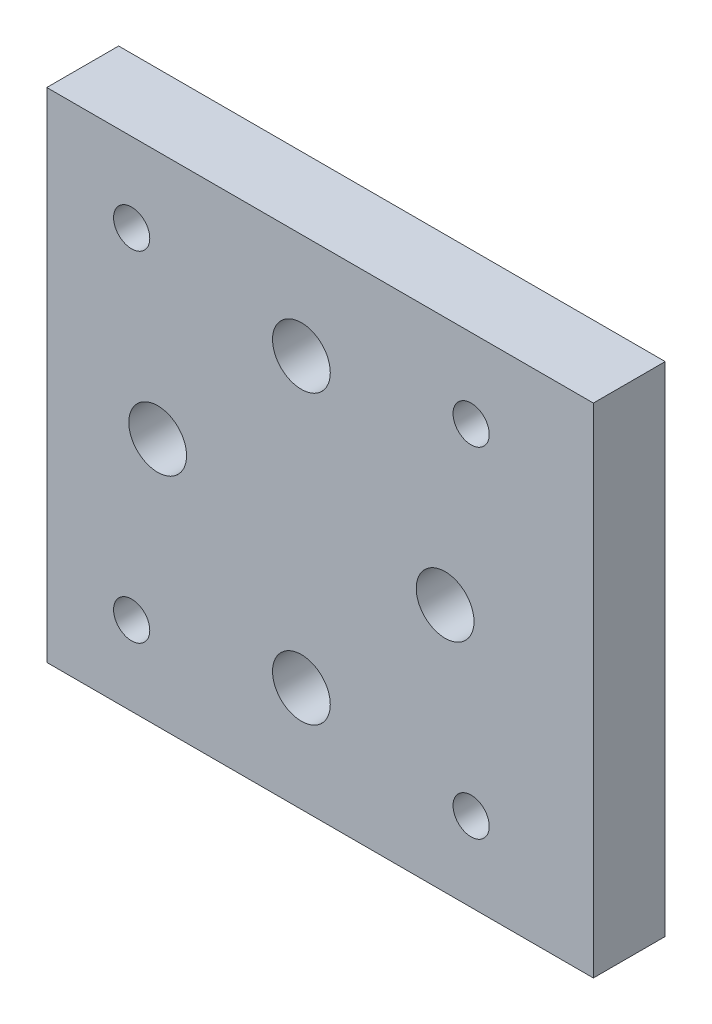
ISO-10303-21;
HEADER;
FILE_DESCRIPTION(('STEP AP214'),'2;1');
FILE_NAME('part.step','',(''),(''),'','','');
FILE_SCHEMA(('AUTOMOTIVE_DESIGN { 1 0 10303 214 1 1 1 1 }'));
ENDSEC;
DATA;
#1=APPLICATION_CONTEXT('core data for automotive mechanical design processes');
#2=APPLICATION_PROTOCOL_DEFINITION('international standard','automotive_design',2000,#1);
#3=PRODUCT_CONTEXT('',#1,'mechanical');
#4=PRODUCT('Part','Part','',(#3));
#5=PRODUCT_RELATED_PRODUCT_CATEGORY('part','',(#4));
#6=PRODUCT_DEFINITION_FORMATION('','',#4);
#7=PRODUCT_DEFINITION_CONTEXT('part definition',#1,'design');
#8=PRODUCT_DEFINITION('design','',#6,#7);
#9=PRODUCT_DEFINITION_SHAPE('','',#8);
#10=(LENGTH_UNIT() NAMED_UNIT(*) SI_UNIT(.MILLI.,.METRE.));
#11=(NAMED_UNIT(*) PLANE_ANGLE_UNIT() SI_UNIT($,.RADIAN.));
#12=(NAMED_UNIT(*) SI_UNIT($,.STERADIAN.) SOLID_ANGLE_UNIT());
#13=UNCERTAINTY_MEASURE_WITH_UNIT(LENGTH_MEASURE(1.E-05),#10,'distance_accuracy_value','');
#14=(GEOMETRIC_REPRESENTATION_CONTEXT(3) GLOBAL_UNCERTAINTY_ASSIGNED_CONTEXT((#13)) GLOBAL_UNIT_ASSIGNED_CONTEXT((#10,
#11,#12)) REPRESENTATION_CONTEXT('',''));
#15=CARTESIAN_POINT('',(0.,0.,0.));
#16=DIRECTION('',(0.,0.,1.));
#17=DIRECTION('',(1.,0.,0.));
#18=AXIS2_PLACEMENT_3D('',#15,#16,#17);
#19=CARTESIAN_POINT('',(48.3,0.,6.35));
#20=DIRECTION('',(1.,0.,0.));
#21=DIRECTION('',(0.,1.,0.));
#22=AXIS2_PLACEMENT_3D('',#19,#20,#21);
#23=PLANE('',#22);
#24=DIRECTION('',(0.,-1.,0.));
#25=VECTOR('',#24,1.);
#26=CARTESIAN_POINT('',(48.3,0.,0.));
#27=LINE('',#26,#25);
#28=CARTESIAN_POINT('',(48.3,0.,0.));
#29=VERTEX_POINT('',#28);
#30=CARTESIAN_POINT('',(48.3,-44.,0.));
#31=VERTEX_POINT('',#30);
#32=EDGE_CURVE('E140',#29,#31,#27,.T.);
#33=ORIENTED_EDGE('',*,*,#32,.F.);
#34=DIRECTION('',(0.,0.,-1.));
#35=VECTOR('',#34,1.);
#36=CARTESIAN_POINT('',(48.3,0.,6.35));
#37=LINE('',#36,#35);
#38=CARTESIAN_POINT('',(48.3,0.,6.35));
#39=VERTEX_POINT('',#38);
#40=EDGE_CURVE('E11',#39,#29,#37,.T.);
#41=ORIENTED_EDGE('',*,*,#40,.F.);
#42=DIRECTION('',(0.,-1.,0.));
#43=VECTOR('',#42,1.);
#44=CARTESIAN_POINT('',(48.3,0.,6.35));
#45=LINE('',#44,#43);
#46=CARTESIAN_POINT('',(48.3,-44.,6.35));
#47=VERTEX_POINT('',#46);
#48=EDGE_CURVE('E109',#39,#47,#45,.T.);
#49=ORIENTED_EDGE('',*,*,#48,.T.);
#50=DIRECTION('',(0.,0.,-1.));
#51=VECTOR('',#50,1.);
#52=CARTESIAN_POINT('',(48.3,-44.,6.35));
#53=LINE('',#52,#51);
#54=EDGE_CURVE('E88',#47,#31,#53,.T.);
#55=ORIENTED_EDGE('',*,*,#54,.T.);
#56=EDGE_LOOP('',(#33,#41,#49,#55));
#57=FACE_BOUND('',#56,.T.);
#58=ADVANCED_FACE('F48',(#57),#23,.T.);
#59=CARTESIAN_POINT('',(0.,0.,6.35));
#60=DIRECTION('',(0.,1.,0.));
#61=DIRECTION('',(0.,0.,1.));
#62=AXIS2_PLACEMENT_3D('',#59,#60,#61);
#63=PLANE('',#62);
#64=DIRECTION('',(1.,0.,0.));
#65=VECTOR('',#64,1.);
#66=CARTESIAN_POINT('',(0.,0.,0.));
#67=LINE('',#66,#65);
#68=CARTESIAN_POINT('',(0.,0.,0.));
#69=VERTEX_POINT('',#68);
#70=EDGE_CURVE('E100',#69,#29,#67,.T.);
#71=ORIENTED_EDGE('',*,*,#70,.F.);
#72=DIRECTION('',(0.,0.,-1.));
#73=VECTOR('',#72,1.);
#74=CARTESIAN_POINT('',(0.,0.,6.35));
#75=LINE('',#74,#73);
#76=CARTESIAN_POINT('',(0.,0.,6.35));
#77=VERTEX_POINT('',#76);
#78=EDGE_CURVE('E57',#77,#69,#75,.T.);
#79=ORIENTED_EDGE('',*,*,#78,.F.);
#80=DIRECTION('',(1.,0.,0.));
#81=VECTOR('',#80,1.);
#82=CARTESIAN_POINT('',(0.,0.,6.35));
#83=LINE('',#82,#81);
#84=EDGE_CURVE('E98',#77,#39,#83,.T.);
#85=ORIENTED_EDGE('',*,*,#84,.T.);
#86=ORIENTED_EDGE('',*,*,#40,.T.);
#87=EDGE_LOOP('',(#71,#79,#85,#86));
#88=FACE_BOUND('',#87,.T.);
#89=ADVANCED_FACE('F96',(#88),#63,.T.);
#90=CARTESIAN_POINT('',(0.,0.,6.35));
#91=DIRECTION('',(1.,0.,0.));
#92=DIRECTION('',(0.,1.,0.));
#93=AXIS2_PLACEMENT_3D('',#90,#91,#92);
#94=PLANE('',#93);
#95=DIRECTION('',(0.,-1.,0.));
#96=VECTOR('',#95,1.);
#97=CARTESIAN_POINT('',(0.,0.,0.));
#98=LINE('',#97,#96);
#99=CARTESIAN_POINT('',(0.,-44.,0.));
#100=VERTEX_POINT('',#99);
#101=EDGE_CURVE('E143',#69,#100,#98,.T.);
#102=ORIENTED_EDGE('',*,*,#101,.T.);
#103=DIRECTION('',(0.,0.,-1.));
#104=VECTOR('',#103,1.);
#105=CARTESIAN_POINT('',(0.,-44.,6.35));
#106=LINE('',#105,#104);
#107=CARTESIAN_POINT('',(0.,-44.,6.35));
#108=VERTEX_POINT('',#107);
#109=EDGE_CURVE('E103',#108,#100,#106,.T.);
#110=ORIENTED_EDGE('',*,*,#109,.F.);
#111=DIRECTION('',(0.,-1.,0.));
#112=VECTOR('',#111,1.);
#113=CARTESIAN_POINT('',(0.,0.,6.35));
#114=LINE('',#113,#112);
#115=EDGE_CURVE('E105',#77,#108,#114,.T.);
#116=ORIENTED_EDGE('',*,*,#115,.F.);
#117=ORIENTED_EDGE('',*,*,#78,.T.);
#118=EDGE_LOOP('',(#102,#110,#116,#117));
#119=FACE_BOUND('',#118,.T.);
#120=ADVANCED_FACE('F106',(#119),#94,.F.);
#121=CARTESIAN_POINT('',(7.5,-37.,6.35));
#122=DIRECTION('',(0.,0.,-1.));
#123=DIRECTION('',(-1.,0.,0.));
#124=AXIS2_PLACEMENT_3D('',#121,#122,#123);
#125=CYLINDRICAL_SURFACE('',#124,1.6);
#126=CARTESIAN_POINT('',(7.5,-37.,6.35));
#127=DIRECTION('',(0.,0.,1.));
#128=DIRECTION('',(1.,0.,0.));
#129=AXIS2_PLACEMENT_3D('',#126,#127,#128);
#130=CIRCLE('',#129,1.6);
#131=CARTESIAN_POINT('',(9.1,-37.,6.35));
#132=VERTEX_POINT('',#131);
#133=EDGE_CURVE('E111',#132,#132,#130,.T.);
#134=ORIENTED_EDGE('',*,*,#133,.T.);
#135=EDGE_LOOP('',(#134));
#136=FACE_BOUND('',#135,.T.);
#137=CARTESIAN_POINT('',(7.5,-37.,0.));
#138=DIRECTION('',(0.,0.,1.));
#139=DIRECTION('',(1.,0.,0.));
#140=AXIS2_PLACEMENT_3D('',#137,#138,#139);
#141=CIRCLE('',#140,1.6);
#142=CARTESIAN_POINT('',(9.1,-37.,0.));
#143=VERTEX_POINT('',#142);
#144=EDGE_CURVE('E137',#143,#143,#141,.T.);
#145=ORIENTED_EDGE('',*,*,#144,.F.);
#146=EDGE_LOOP('',(#145));
#147=FACE_BOUND('',#146,.T.);
#148=ADVANCED_FACE('F159',(#136,#147),#125,.F.);
#149=CARTESIAN_POINT('',(22.5,-9.3,6.35));
#150=DIRECTION('',(0.,0.,-1.));
#151=DIRECTION('',(-1.,0.,0.));
#152=AXIS2_PLACEMENT_3D('',#149,#150,#151);
#153=CYLINDRICAL_SURFACE('',#152,2.5527);
#154=CARTESIAN_POINT('',(22.5,-9.3,6.35));
#155=DIRECTION('',(0.,0.,1.));
#156=DIRECTION('',(1.,0.,0.));
#157=AXIS2_PLACEMENT_3D('',#154,#155,#156);
#158=CIRCLE('',#157,2.5527);
#159=CARTESIAN_POINT('',(25.0527,-9.3,6.35));
#160=VERTEX_POINT('',#159);
#161=EDGE_CURVE('E379',#160,#160,#158,.T.);
#162=ORIENTED_EDGE('',*,*,#161,.T.);
#163=EDGE_LOOP('',(#162));
#164=FACE_BOUND('',#163,.T.);
#165=CARTESIAN_POINT('',(22.5,-9.3,0.));
#166=DIRECTION('',(0.,0.,1.));
#167=DIRECTION('',(1.,0.,0.));
#168=AXIS2_PLACEMENT_3D('',#165,#166,#167);
#169=CIRCLE('',#168,2.5527);
#170=CARTESIAN_POINT('',(25.0527,-9.3,0.));
#171=VERTEX_POINT('',#170);
#172=EDGE_CURVE('E134',#171,#171,#169,.T.);
#173=ORIENTED_EDGE('',*,*,#172,.F.);
#174=EDGE_LOOP('',(#173));
#175=FACE_BOUND('',#174,.T.);
#176=ADVANCED_FACE('F162',(#164,#175),#153,.F.);
#177=CARTESIAN_POINT('',(35.2,-22.,6.35));
#178=DIRECTION('',(0.,0.,-1.));
#179=DIRECTION('',(-1.,0.,0.));
#180=AXIS2_PLACEMENT_3D('',#177,#178,#179);
#181=CYLINDRICAL_SURFACE('',#180,2.5527);
#182=CARTESIAN_POINT('',(35.2,-22.,6.35));
#183=DIRECTION('',(0.,0.,1.));
#184=DIRECTION('',(1.,0.,0.));
#185=AXIS2_PLACEMENT_3D('',#182,#183,#184);
#186=CIRCLE('',#185,2.5527);
#187=CARTESIAN_POINT('',(37.7527,-22.,6.35));
#188=VERTEX_POINT('',#187);
#189=EDGE_CURVE('E375',#188,#188,#186,.T.);
#190=ORIENTED_EDGE('',*,*,#189,.T.);
#191=EDGE_LOOP('',(#190));
#192=FACE_BOUND('',#191,.T.);
#193=CARTESIAN_POINT('',(35.2,-22.,0.));
#194=DIRECTION('',(0.,0.,1.));
#195=DIRECTION('',(1.,0.,0.));
#196=AXIS2_PLACEMENT_3D('',#193,#194,#195);
#197=CIRCLE('',#196,2.5527);
#198=CARTESIAN_POINT('',(37.7527,-22.,0.));
#199=VERTEX_POINT('',#198);
#200=EDGE_CURVE('E131',#199,#199,#197,.T.);
#201=ORIENTED_EDGE('',*,*,#200,.F.);
#202=EDGE_LOOP('',(#201));
#203=FACE_BOUND('',#202,.T.);
#204=ADVANCED_FACE('F166',(#192,#203),#181,.F.);
#205=CARTESIAN_POINT('',(9.8,-22.,6.35));
#206=DIRECTION('',(0.,0.,-1.));
#207=DIRECTION('',(-1.,0.,0.));
#208=AXIS2_PLACEMENT_3D('',#205,#206,#207);
#209=CYLINDRICAL_SURFACE('',#208,2.5527);
#210=CARTESIAN_POINT('',(9.8,-22.,6.35));
#211=DIRECTION('',(0.,0.,1.));
#212=DIRECTION('',(1.,0.,0.));
#213=AXIS2_PLACEMENT_3D('',#210,#211,#212);
#214=CIRCLE('',#213,2.5527);
#215=CARTESIAN_POINT('',(12.3527,-22.,6.35));
#216=VERTEX_POINT('',#215);
#217=EDGE_CURVE('E371',#216,#216,#214,.T.);
#218=ORIENTED_EDGE('',*,*,#217,.T.);
#219=EDGE_LOOP('',(#218));
#220=FACE_BOUND('',#219,.T.);
#221=CARTESIAN_POINT('',(9.8,-22.,0.));
#222=DIRECTION('',(0.,0.,1.));
#223=DIRECTION('',(1.,0.,0.));
#224=AXIS2_PLACEMENT_3D('',#221,#222,#223);
#225=CIRCLE('',#224,2.5527);
#226=CARTESIAN_POINT('',(12.3527,-22.,0.));
#227=VERTEX_POINT('',#226);
#228=EDGE_CURVE('E128',#227,#227,#225,.T.);
#229=ORIENTED_EDGE('',*,*,#228,.F.);
#230=EDGE_LOOP('',(#229));
#231=FACE_BOUND('',#230,.T.);
#232=ADVANCED_FACE('F170',(#220,#231),#209,.F.);
#233=CARTESIAN_POINT('',(22.5,-34.7,6.35));
#234=DIRECTION('',(0.,0.,-1.));
#235=DIRECTION('',(-1.,0.,0.));
#236=AXIS2_PLACEMENT_3D('',#233,#234,#235);
#237=CYLINDRICAL_SURFACE('',#236,2.5527);
#238=CARTESIAN_POINT('',(22.5,-34.7,6.35));
#239=DIRECTION('',(0.,0.,1.));
#240=DIRECTION('',(1.,0.,0.));
#241=AXIS2_PLACEMENT_3D('',#238,#239,#240);
#242=CIRCLE('',#241,2.5527);
#243=CARTESIAN_POINT('',(25.0527,-34.7,6.35));
#244=VERTEX_POINT('',#243);
#245=EDGE_CURVE('E367',#244,#244,#242,.T.);
#246=ORIENTED_EDGE('',*,*,#245,.T.);
#247=EDGE_LOOP('',(#246));
#248=FACE_BOUND('',#247,.T.);
#249=CARTESIAN_POINT('',(22.5,-34.7,0.));
#250=DIRECTION('',(0.,0.,1.));
#251=DIRECTION('',(1.,0.,0.));
#252=AXIS2_PLACEMENT_3D('',#249,#250,#251);
#253=CIRCLE('',#252,2.5527);
#254=CARTESIAN_POINT('',(25.0527,-34.7,0.));
#255=VERTEX_POINT('',#254);
#256=EDGE_CURVE('E125',#255,#255,#253,.T.);
#257=ORIENTED_EDGE('',*,*,#256,.F.);
#258=EDGE_LOOP('',(#257));
#259=FACE_BOUND('',#258,.T.);
#260=ADVANCED_FACE('F174',(#248,#259),#237,.F.);
#261=CARTESIAN_POINT('',(37.5,-37.,6.35));
#262=DIRECTION('',(0.,0.,-1.));
#263=DIRECTION('',(-1.,0.,0.));
#264=AXIS2_PLACEMENT_3D('',#261,#262,#263);
#265=CYLINDRICAL_SURFACE('',#264,1.60000000000001);
#266=CARTESIAN_POINT('',(37.5,-37.,6.35));
#267=DIRECTION('',(0.,0.,1.));
#268=DIRECTION('',(1.,0.,0.));
#269=AXIS2_PLACEMENT_3D('',#266,#267,#268);
#270=CIRCLE('',#269,1.60000000000001);
#271=CARTESIAN_POINT('',(39.1,-37.,6.35));
#272=VERTEX_POINT('',#271);
#273=EDGE_CURVE('E363',#272,#272,#270,.T.);
#274=ORIENTED_EDGE('',*,*,#273,.T.);
#275=EDGE_LOOP('',(#274));
#276=FACE_BOUND('',#275,.T.);
#277=CARTESIAN_POINT('',(37.5,-37.,0.));
#278=DIRECTION('',(0.,0.,1.));
#279=DIRECTION('',(1.,0.,0.));
#280=AXIS2_PLACEMENT_3D('',#277,#278,#279);
#281=CIRCLE('',#280,1.60000000000001);
#282=CARTESIAN_POINT('',(39.1,-37.,0.));
#283=VERTEX_POINT('',#282);
#284=EDGE_CURVE('E122',#283,#283,#281,.T.);
#285=ORIENTED_EDGE('',*,*,#284,.F.);
#286=EDGE_LOOP('',(#285));
#287=FACE_BOUND('',#286,.T.);
#288=ADVANCED_FACE('F178',(#276,#287),#265,.F.);
#289=CARTESIAN_POINT('',(37.5,-7.,6.35));
#290=DIRECTION('',(0.,0.,-1.));
#291=DIRECTION('',(-1.,0.,0.));
#292=AXIS2_PLACEMENT_3D('',#289,#290,#291);
#293=CYLINDRICAL_SURFACE('',#292,1.6);
#294=CARTESIAN_POINT('',(37.5,-7.,6.35));
#295=DIRECTION('',(0.,0.,1.));
#296=DIRECTION('',(1.,0.,0.));
#297=AXIS2_PLACEMENT_3D('',#294,#295,#296);
#298=CIRCLE('',#297,1.6);
#299=CARTESIAN_POINT('',(39.1,-7.,6.35));
#300=VERTEX_POINT('',#299);
#301=EDGE_CURVE('E192',#300,#300,#298,.T.);
#302=ORIENTED_EDGE('',*,*,#301,.T.);
#303=EDGE_LOOP('',(#302));
#304=FACE_BOUND('',#303,.T.);
#305=CARTESIAN_POINT('',(37.5,-7.,0.));
#306=DIRECTION('',(0.,0.,1.));
#307=DIRECTION('',(1.,0.,0.));
#308=AXIS2_PLACEMENT_3D('',#305,#306,#307);
#309=CIRCLE('',#308,1.6);
#310=CARTESIAN_POINT('',(39.1,-7.,0.));
#311=VERTEX_POINT('',#310);
#312=EDGE_CURVE('E119',#311,#311,#309,.T.);
#313=ORIENTED_EDGE('',*,*,#312,.F.);
#314=EDGE_LOOP('',(#313));
#315=FACE_BOUND('',#314,.T.);
#316=ADVANCED_FACE('F181',(#304,#315),#293,.F.);
#317=CARTESIAN_POINT('',(7.5,-7.,6.35));
#318=DIRECTION('',(0.,0.,-1.));
#319=DIRECTION('',(-1.,0.,0.));
#320=AXIS2_PLACEMENT_3D('',#317,#318,#319);
#321=CYLINDRICAL_SURFACE('',#320,1.6);
#322=CARTESIAN_POINT('',(7.5,-7.,6.35));
#323=DIRECTION('',(0.,0.,1.));
#324=DIRECTION('',(1.,0.,0.));
#325=AXIS2_PLACEMENT_3D('',#322,#323,#324);
#326=CIRCLE('',#325,1.6);
#327=CARTESIAN_POINT('',(9.1,-7.,6.35));
#328=VERTEX_POINT('',#327);
#329=EDGE_CURVE('E146',#328,#328,#326,.T.);
#330=ORIENTED_EDGE('',*,*,#329,.T.);
#331=EDGE_LOOP('',(#330));
#332=FACE_BOUND('',#331,.T.);
#333=CARTESIAN_POINT('',(7.5,-7.,0.));
#334=DIRECTION('',(0.,0.,1.));
#335=DIRECTION('',(1.,0.,0.));
#336=AXIS2_PLACEMENT_3D('',#333,#334,#335);
#337=CIRCLE('',#336,1.6);
#338=CARTESIAN_POINT('',(9.1,-7.,0.));
#339=VERTEX_POINT('',#338);
#340=EDGE_CURVE('E116',#339,#339,#337,.T.);
#341=ORIENTED_EDGE('',*,*,#340,.F.);
#342=EDGE_LOOP('',(#341));
#343=FACE_BOUND('',#342,.T.);
#344=ADVANCED_FACE('F50',(#332,#343),#321,.F.);
#345=CARTESIAN_POINT('',(0.,-44.,6.35));
#346=DIRECTION('',(0.,1.,0.));
#347=DIRECTION('',(0.,0.,1.));
#348=AXIS2_PLACEMENT_3D('',#345,#346,#347);
#349=PLANE('',#348);
#350=DIRECTION('',(1.,0.,0.));
#351=VECTOR('',#350,1.);
#352=CARTESIAN_POINT('',(0.,-44.,0.));
#353=LINE('',#352,#351);
#354=EDGE_CURVE('E81',#100,#31,#353,.T.);
#355=ORIENTED_EDGE('',*,*,#354,.T.);
#356=ORIENTED_EDGE('',*,*,#54,.F.);
#357=DIRECTION('',(1.,0.,0.));
#358=VECTOR('',#357,1.);
#359=CARTESIAN_POINT('',(0.,-44.,6.35));
#360=LINE('',#359,#358);
#361=EDGE_CURVE('E65',#108,#47,#360,.T.);
#362=ORIENTED_EDGE('',*,*,#361,.F.);
#363=ORIENTED_EDGE('',*,*,#109,.T.);
#364=EDGE_LOOP('',(#355,#356,#362,#363));
#365=FACE_BOUND('',#364,.T.);
#366=ADVANCED_FACE('F149',(#365),#349,.F.);
#367=CARTESIAN_POINT('',(0.,0.,6.35));
#368=DIRECTION('',(0.,0.,1.));
#369=DIRECTION('',(1.,0.,0.));
#370=AXIS2_PLACEMENT_3D('',#367,#368,#369);
#371=PLANE('',#370);
#372=ORIENTED_EDGE('',*,*,#329,.F.);
#373=EDGE_LOOP('',(#372));
#374=FACE_BOUND('',#373,.T.);
#375=ORIENTED_EDGE('',*,*,#301,.F.);
#376=EDGE_LOOP('',(#375));
#377=FACE_BOUND('',#376,.T.);
#378=ORIENTED_EDGE('',*,*,#273,.F.);
#379=EDGE_LOOP('',(#378));
#380=FACE_BOUND('',#379,.T.);
#381=ORIENTED_EDGE('',*,*,#245,.F.);
#382=EDGE_LOOP('',(#381));
#383=FACE_BOUND('',#382,.T.);
#384=ORIENTED_EDGE('',*,*,#217,.F.);
#385=EDGE_LOOP('',(#384));
#386=FACE_BOUND('',#385,.T.);
#387=ORIENTED_EDGE('',*,*,#189,.F.);
#388=EDGE_LOOP('',(#387));
#389=FACE_BOUND('',#388,.T.);
#390=ORIENTED_EDGE('',*,*,#161,.F.);
#391=EDGE_LOOP('',(#390));
#392=FACE_BOUND('',#391,.T.);
#393=ORIENTED_EDGE('',*,*,#133,.F.);
#394=EDGE_LOOP('',(#393));
#395=FACE_BOUND('',#394,.T.);
#396=ORIENTED_EDGE('',*,*,#48,.F.);
#397=ORIENTED_EDGE('',*,*,#84,.F.);
#398=ORIENTED_EDGE('',*,*,#115,.T.);
#399=ORIENTED_EDGE('',*,*,#361,.T.);
#400=EDGE_LOOP('',(#396,#397,#398,#399));
#401=FACE_BOUND('',#400,.T.);
#402=ADVANCED_FACE('F108',(#374,#377,#380,#383,#386,#389,#392,#395,#401),#371,.T.);
#403=CARTESIAN_POINT('',(0.,0.,0.));
#404=DIRECTION('',(0.,0.,1.));
#405=DIRECTION('',(1.,0.,0.));
#406=AXIS2_PLACEMENT_3D('',#403,#404,#405);
#407=PLANE('',#406);
#408=ORIENTED_EDGE('',*,*,#340,.T.);
#409=EDGE_LOOP('',(#408));
#410=FACE_BOUND('',#409,.T.);
#411=ORIENTED_EDGE('',*,*,#312,.T.);
#412=EDGE_LOOP('',(#411));
#413=FACE_BOUND('',#412,.T.);
#414=ORIENTED_EDGE('',*,*,#284,.T.);
#415=EDGE_LOOP('',(#414));
#416=FACE_BOUND('',#415,.T.);
#417=ORIENTED_EDGE('',*,*,#256,.T.);
#418=EDGE_LOOP('',(#417));
#419=FACE_BOUND('',#418,.T.);
#420=ORIENTED_EDGE('',*,*,#228,.T.);
#421=EDGE_LOOP('',(#420));
#422=FACE_BOUND('',#421,.T.);
#423=ORIENTED_EDGE('',*,*,#200,.T.);
#424=EDGE_LOOP('',(#423));
#425=FACE_BOUND('',#424,.T.);
#426=ORIENTED_EDGE('',*,*,#172,.T.);
#427=EDGE_LOOP('',(#426));
#428=FACE_BOUND('',#427,.T.);
#429=ORIENTED_EDGE('',*,*,#144,.T.);
#430=EDGE_LOOP('',(#429));
#431=FACE_BOUND('',#430,.T.);
#432=ORIENTED_EDGE('',*,*,#32,.T.);
#433=ORIENTED_EDGE('',*,*,#354,.F.);
#434=ORIENTED_EDGE('',*,*,#101,.F.);
#435=ORIENTED_EDGE('',*,*,#70,.T.);
#436=EDGE_LOOP('',(#432,#433,#434,#435));
#437=FACE_BOUND('',#436,.T.);
#438=ADVANCED_FACE('F150',(#410,#413,#416,#419,#422,#425,#428,#431,#437),#407,.F.);
#439=CLOSED_SHELL('',(#58,#89,#120,#148,#176,#204,#232,#260,#288,#316,#344,#366,#402,#438));
#440=MANIFOLD_SOLID_BREP('B2',#439);
#441=ADVANCED_BREP_SHAPE_REPRESENTATION('',(#18,#440),#14);
#442=SHAPE_DEFINITION_REPRESENTATION(#9,#441);
ENDSEC;
END-ISO-10303-21;
